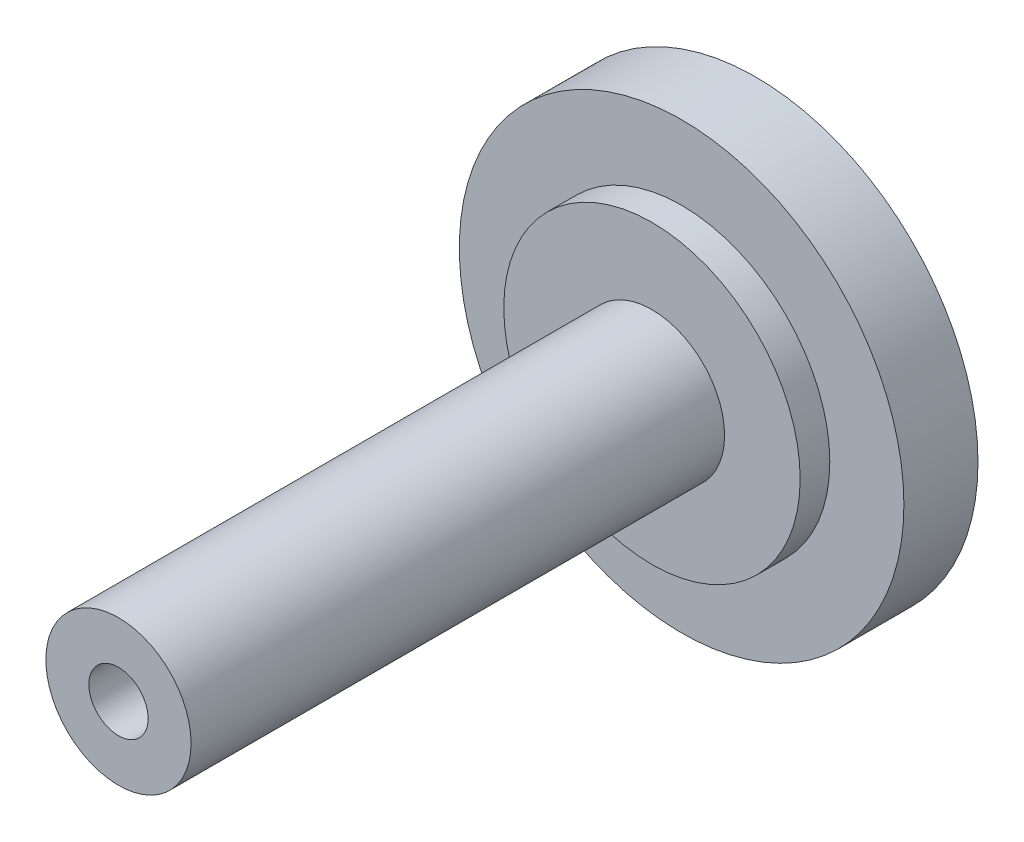
ISO-10303-21;
HEADER;
FILE_DESCRIPTION(('STEP AP214'),'2;1');
FILE_NAME('part.step','',(''),(''),'','','');
FILE_SCHEMA(('AUTOMOTIVE_DESIGN { 1 0 10303 214 1 1 1 1 }'));
ENDSEC;
DATA;
#1=APPLICATION_CONTEXT('core data for automotive mechanical design processes');
#2=APPLICATION_PROTOCOL_DEFINITION('international standard','automotive_design',2000,#1);
#3=PRODUCT_CONTEXT('',#1,'mechanical');
#4=PRODUCT('Part','Part','',(#3));
#5=PRODUCT_RELATED_PRODUCT_CATEGORY('part','',(#4));
#6=PRODUCT_DEFINITION_FORMATION('','',#4);
#7=PRODUCT_DEFINITION_CONTEXT('part definition',#1,'design');
#8=PRODUCT_DEFINITION('design','',#6,#7);
#9=PRODUCT_DEFINITION_SHAPE('','',#8);
#10=(LENGTH_UNIT() NAMED_UNIT(*) SI_UNIT(.MILLI.,.METRE.));
#11=(NAMED_UNIT(*) PLANE_ANGLE_UNIT() SI_UNIT($,.RADIAN.));
#12=(NAMED_UNIT(*) SI_UNIT($,.STERADIAN.) SOLID_ANGLE_UNIT());
#13=UNCERTAINTY_MEASURE_WITH_UNIT(LENGTH_MEASURE(1.E-05),#10,'distance_accuracy_value','');
#14=(GEOMETRIC_REPRESENTATION_CONTEXT(3) GLOBAL_UNCERTAINTY_ASSIGNED_CONTEXT((#13)) GLOBAL_UNIT_ASSIGNED_CONTEXT((#10,
#11,#12)) REPRESENTATION_CONTEXT('',''));
#15=CARTESIAN_POINT('',(0.,0.,0.));
#16=DIRECTION('',(0.,0.,1.));
#17=DIRECTION('',(1.,0.,0.));
#18=AXIS2_PLACEMENT_3D('',#15,#16,#17);
#19=CARTESIAN_POINT('',(0.,0.,2.5));
#20=DIRECTION('',(0.,0.,-1.));
#21=DIRECTION('',(-1.,0.,0.));
#22=AXIS2_PLACEMENT_3D('',#19,#20,#21);
#23=CYLINDRICAL_SURFACE('',#22,7.5);
#24=CARTESIAN_POINT('',(0.,0.,2.5));
#25=DIRECTION('',(0.,0.,1.));
#26=DIRECTION('',(1.,0.,0.));
#27=AXIS2_PLACEMENT_3D('',#24,#25,#26);
#28=CIRCLE('',#27,7.5);
#29=CARTESIAN_POINT('',(7.5,0.,2.5));
#30=VERTEX_POINT('',#29);
#31=EDGE_CURVE('E79',#30,#30,#28,.T.);
#32=ORIENTED_EDGE('',*,*,#31,.F.);
#33=EDGE_LOOP('',(#32));
#34=FACE_BOUND('',#33,.T.);
#35=CARTESIAN_POINT('',(0.,0.,0.));
#36=DIRECTION('',(0.,0.,1.));
#37=DIRECTION('',(1.,0.,0.));
#38=AXIS2_PLACEMENT_3D('',#35,#36,#37);
#39=CIRCLE('',#38,7.5);
#40=CARTESIAN_POINT('',(7.5,0.,0.));
#41=VERTEX_POINT('',#40);
#42=EDGE_CURVE('E93',#41,#41,#39,.T.);
#43=ORIENTED_EDGE('',*,*,#42,.T.);
#44=EDGE_LOOP('',(#43));
#45=FACE_BOUND('',#44,.T.);
#46=ADVANCED_FACE('F42',(#34,#45),#23,.T.);
#47=CARTESIAN_POINT('',(0.,0.,2.5));
#48=DIRECTION('',(0.,0.,1.));
#49=DIRECTION('',(1.,0.,0.));
#50=AXIS2_PLACEMENT_3D('',#47,#48,#49);
#51=PLANE('',#50);
#52=CARTESIAN_POINT('',(0.,0.,2.5));
#53=DIRECTION('',(0.,0.,1.));
#54=DIRECTION('',(1.,0.,0.));
#55=AXIS2_PLACEMENT_3D('',#52,#53,#54);
#56=CIRCLE('',#55,5.);
#57=CARTESIAN_POINT('',(5.,0.,2.5));
#58=VERTEX_POINT('',#57);
#59=EDGE_CURVE('E101',#58,#58,#56,.T.);
#60=ORIENTED_EDGE('',*,*,#59,.F.);
#61=EDGE_LOOP('',(#60));
#62=FACE_BOUND('',#61,.T.);
#63=ORIENTED_EDGE('',*,*,#31,.T.);
#64=EDGE_LOOP('',(#63));
#65=FACE_BOUND('',#64,.T.);
#66=ADVANCED_FACE('F137',(#62,#65),#51,.T.);
#67=CARTESIAN_POINT('',(0.,0.,0.));
#68=DIRECTION('',(0.,0.,1.));
#69=DIRECTION('',(1.,0.,0.));
#70=AXIS2_PLACEMENT_3D('',#67,#68,#69);
#71=PLANE('',#70);
#72=DIRECTION('',(0.,-1.,0.));
#73=VECTOR('',#72,1.);
#74=CARTESIAN_POINT('',(3.,3.1,0.));
#75=LINE('',#74,#73);
#76=CARTESIAN_POINT('',(3.,3.1,0.));
#77=VERTEX_POINT('',#76);
#78=CARTESIAN_POINT('',(3.,-3.1,0.));
#79=VERTEX_POINT('',#78);
#80=EDGE_CURVE('E78',#77,#79,#75,.T.);
#81=ORIENTED_EDGE('',*,*,#80,.F.);
#82=DIRECTION('',(-1.,0.,0.));
#83=VECTOR('',#82,1.);
#84=CARTESIAN_POINT('',(0.,3.1,0.));
#85=LINE('',#84,#83);
#86=CARTESIAN_POINT('',(-3.,3.1,0.));
#87=VERTEX_POINT('',#86);
#88=EDGE_CURVE('E11',#77,#87,#85,.T.);
#89=ORIENTED_EDGE('',*,*,#88,.T.);
#90=DIRECTION('',(0.,-1.,0.));
#91=VECTOR('',#90,1.);
#92=CARTESIAN_POINT('',(-3.,3.1,0.));
#93=LINE('',#92,#91);
#94=CARTESIAN_POINT('',(-3.,-3.1,0.));
#95=VERTEX_POINT('',#94);
#96=EDGE_CURVE('E50',#95,#87,#93,.F.);
#97=ORIENTED_EDGE('',*,*,#96,.F.);
#98=DIRECTION('',(-1.,0.,0.));
#99=VECTOR('',#98,1.);
#100=CARTESIAN_POINT('',(0.,-3.1,0.));
#101=LINE('',#100,#99);
#102=EDGE_CURVE('E73',#79,#95,#101,.T.);
#103=ORIENTED_EDGE('',*,*,#102,.F.);
#104=EDGE_LOOP('',(#81,#89,#97,#103));
#105=FACE_BOUND('',#104,.T.);
#106=ORIENTED_EDGE('',*,*,#42,.F.);
#107=EDGE_LOOP('',(#106));
#108=FACE_BOUND('',#107,.T.);
#109=ADVANCED_FACE('F85',(#105,#108),#71,.F.);
#110=CARTESIAN_POINT('',(0.,0.,3.5));
#111=DIRECTION('',(0.,0.,-1.));
#112=DIRECTION('',(-1.,0.,0.));
#113=AXIS2_PLACEMENT_3D('',#110,#111,#112);
#114=CYLINDRICAL_SURFACE('',#113,5.);
#115=CARTESIAN_POINT('',(0.,0.,3.5));
#116=DIRECTION('',(0.,0.,1.));
#117=DIRECTION('',(1.,0.,0.));
#118=AXIS2_PLACEMENT_3D('',#115,#116,#117);
#119=CIRCLE('',#118,5.);
#120=CARTESIAN_POINT('',(5.,0.,3.5));
#121=VERTEX_POINT('',#120);
#122=EDGE_CURVE('E97',#121,#121,#119,.T.);
#123=ORIENTED_EDGE('',*,*,#122,.F.);
#124=EDGE_LOOP('',(#123));
#125=FACE_BOUND('',#124,.T.);
#126=ORIENTED_EDGE('',*,*,#59,.T.);
#127=EDGE_LOOP('',(#126));
#128=FACE_BOUND('',#127,.T.);
#129=ADVANCED_FACE('F148',(#125,#128),#114,.T.);
#130=CARTESIAN_POINT('',(0.,0.,3.5));
#131=DIRECTION('',(0.,0.,1.));
#132=DIRECTION('',(1.,0.,0.));
#133=AXIS2_PLACEMENT_3D('',#130,#131,#132);
#134=PLANE('',#133);
#135=CARTESIAN_POINT('',(0.,0.,3.5));
#136=DIRECTION('',(0.,0.,1.));
#137=DIRECTION('',(1.,0.,0.));
#138=AXIS2_PLACEMENT_3D('',#135,#136,#137);
#139=CIRCLE('',#138,2.45);
#140=CARTESIAN_POINT('',(2.45,0.,3.5));
#141=VERTEX_POINT('',#140);
#142=EDGE_CURVE('E109',#141,#141,#139,.T.);
#143=ORIENTED_EDGE('',*,*,#142,.F.);
#144=EDGE_LOOP('',(#143));
#145=FACE_BOUND('',#144,.T.);
#146=ORIENTED_EDGE('',*,*,#122,.T.);
#147=EDGE_LOOP('',(#146));
#148=FACE_BOUND('',#147,.T.);
#149=ADVANCED_FACE('F152',(#145,#148),#134,.T.);
#150=CARTESIAN_POINT('',(0.,0.,21.5));
#151=DIRECTION('',(0.,0.,-1.));
#152=DIRECTION('',(-1.,0.,0.));
#153=AXIS2_PLACEMENT_3D('',#150,#151,#152);
#154=CYLINDRICAL_SURFACE('',#153,2.45);
#155=CARTESIAN_POINT('',(0.,0.,21.5));
#156=DIRECTION('',(0.,0.,1.));
#157=DIRECTION('',(1.,0.,0.));
#158=AXIS2_PLACEMENT_3D('',#155,#156,#157);
#159=CIRCLE('',#158,2.45);
#160=CARTESIAN_POINT('',(2.45,0.,21.5));
#161=VERTEX_POINT('',#160);
#162=EDGE_CURVE('E105',#161,#161,#159,.T.);
#163=ORIENTED_EDGE('',*,*,#162,.F.);
#164=EDGE_LOOP('',(#163));
#165=FACE_BOUND('',#164,.T.);
#166=ORIENTED_EDGE('',*,*,#142,.T.);
#167=EDGE_LOOP('',(#166));
#168=FACE_BOUND('',#167,.T.);
#169=ADVANCED_FACE('F158',(#165,#168),#154,.T.);
#170=CARTESIAN_POINT('',(0.,0.,21.5));
#171=DIRECTION('',(0.,0.,1.));
#172=DIRECTION('',(1.,0.,0.));
#173=AXIS2_PLACEMENT_3D('',#170,#171,#172);
#174=PLANE('',#173);
#175=CARTESIAN_POINT('',(0.,0.,21.5));
#176=DIRECTION('',(0.,0.,1.));
#177=DIRECTION('',(1.,0.,0.));
#178=AXIS2_PLACEMENT_3D('',#175,#176,#177);
#179=CIRCLE('',#178,1.);
#180=CARTESIAN_POINT('',(1.,0.,21.5));
#181=VERTEX_POINT('',#180);
#182=EDGE_CURVE('E116',#181,#181,#179,.T.);
#183=ORIENTED_EDGE('',*,*,#182,.F.);
#184=EDGE_LOOP('',(#183));
#185=FACE_BOUND('',#184,.T.);
#186=ORIENTED_EDGE('',*,*,#162,.T.);
#187=EDGE_LOOP('',(#186));
#188=FACE_BOUND('',#187,.T.);
#189=ADVANCED_FACE('F162',(#185,#188),#174,.T.);
#190=CARTESIAN_POINT('',(0.,0.,11.5));
#191=DIRECTION('',(0.,0.,1.));
#192=DIRECTION('',(1.,0.,0.));
#193=AXIS2_PLACEMENT_3D('',#190,#191,#192);
#194=CYLINDRICAL_SURFACE('',#193,1.);
#195=CARTESIAN_POINT('',(0.,0.,11.5));
#196=DIRECTION('',(0.,0.,1.));
#197=DIRECTION('',(1.,0.,0.));
#198=AXIS2_PLACEMENT_3D('',#195,#196,#197);
#199=CIRCLE('',#198,1.);
#200=CARTESIAN_POINT('',(1.,0.,11.5));
#201=VERTEX_POINT('',#200);
#202=EDGE_CURVE('E112',#201,#201,#199,.T.);
#203=ORIENTED_EDGE('',*,*,#202,.F.);
#204=EDGE_LOOP('',(#203));
#205=FACE_BOUND('',#204,.T.);
#206=ORIENTED_EDGE('',*,*,#182,.T.);
#207=EDGE_LOOP('',(#206));
#208=FACE_BOUND('',#207,.T.);
#209=ADVANCED_FACE('F166',(#205,#208),#194,.F.);
#210=CARTESIAN_POINT('',(0.,0.,11.5));
#211=DIRECTION('',(0.,0.,1.));
#212=DIRECTION('',(1.,0.,0.));
#213=AXIS2_PLACEMENT_3D('',#210,#211,#212);
#214=PLANE('',#213);
#215=ORIENTED_EDGE('',*,*,#202,.T.);
#216=EDGE_LOOP('',(#215));
#217=FACE_BOUND('',#216,.T.);
#218=ADVANCED_FACE('F134',(#217),#214,.T.);
#219=CARTESIAN_POINT('',(0.,3.1,0.));
#220=DIRECTION('',(0.,-1.,0.));
#221=DIRECTION('',(0.,0.,-1.));
#222=AXIS2_PLACEMENT_3D('',#219,#220,#221);
#223=CYLINDRICAL_SURFACE('',#222,3.);
#224=ORIENTED_EDGE('',*,*,#96,.T.);
#225=CARTESIAN_POINT('',(0.,3.1,0.));
#226=DIRECTION('',(0.,1.,0.));
#227=DIRECTION('',(0.,0.,1.));
#228=AXIS2_PLACEMENT_3D('',#225,#226,#227);
#229=CIRCLE('',#228,3.);
#230=EDGE_CURVE('E83',#87,#77,#229,.T.);
#231=ORIENTED_EDGE('',*,*,#230,.T.);
#232=ORIENTED_EDGE('',*,*,#80,.T.);
#233=CARTESIAN_POINT('',(0.,-3.1,0.));
#234=DIRECTION('',(0.,1.,0.));
#235=DIRECTION('',(0.,0.,1.));
#236=AXIS2_PLACEMENT_3D('',#233,#234,#235);
#237=CIRCLE('',#236,3.);
#238=EDGE_CURVE('E59',#95,#79,#237,.T.);
#239=ORIENTED_EDGE('',*,*,#238,.F.);
#240=EDGE_LOOP('',(#224,#231,#232,#239));
#241=FACE_BOUND('',#240,.T.);
#242=ADVANCED_FACE('F81',(#241),#223,.F.);
#243=CARTESIAN_POINT('',(0.,3.1,0.));
#244=DIRECTION('',(0.,1.,0.));
#245=DIRECTION('',(0.,0.,1.));
#246=AXIS2_PLACEMENT_3D('',#243,#244,#245);
#247=PLANE('',#246);
#248=ORIENTED_EDGE('',*,*,#230,.F.);
#249=ORIENTED_EDGE('',*,*,#88,.F.);
#250=EDGE_LOOP('',(#248,#249));
#251=FACE_BOUND('',#250,.T.);
#252=ADVANCED_FACE('F126',(#251),#247,.F.);
#253=CARTESIAN_POINT('',(0.,-3.1,0.));
#254=DIRECTION('',(0.,1.,0.));
#255=DIRECTION('',(0.,0.,1.));
#256=AXIS2_PLACEMENT_3D('',#253,#254,#255);
#257=PLANE('',#256);
#258=ORIENTED_EDGE('',*,*,#102,.T.);
#259=ORIENTED_EDGE('',*,*,#238,.T.);
#260=EDGE_LOOP('',(#258,#259));
#261=FACE_BOUND('',#260,.T.);
#262=ADVANCED_FACE('F74',(#261),#257,.T.);
#263=CLOSED_SHELL('',(#46,#66,#109,#129,#149,#169,#189,#209,#218,#242,#252,#262));
#264=MANIFOLD_SOLID_BREP('B2',#263);
#265=ADVANCED_BREP_SHAPE_REPRESENTATION('',(#18,#264),#14);
#266=SHAPE_DEFINITION_REPRESENTATION(#9,#265);
ENDSEC;
END-ISO-10303-21;
